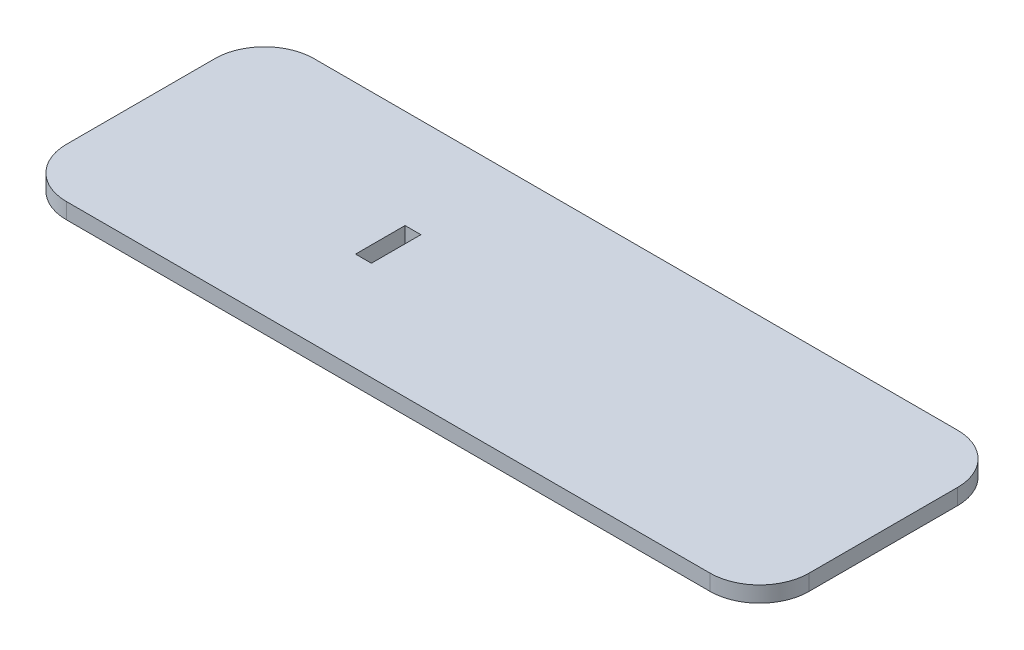
ISO-10303-21;
HEADER;
FILE_DESCRIPTION(('STEP AP214'),'2;1');
FILE_NAME('part.step','',(''),(''),'','','');
FILE_SCHEMA(('AUTOMOTIVE_DESIGN { 1 0 10303 214 1 1 1 1 }'));
ENDSEC;
DATA;
#1=APPLICATION_CONTEXT('core data for automotive mechanical design processes');
#2=APPLICATION_PROTOCOL_DEFINITION('international standard','automotive_design',2000,#1);
#3=PRODUCT_CONTEXT('',#1,'mechanical');
#4=PRODUCT('Part','Part','',(#3));
#5=PRODUCT_RELATED_PRODUCT_CATEGORY('part','',(#4));
#6=PRODUCT_DEFINITION_FORMATION('','',#4);
#7=PRODUCT_DEFINITION_CONTEXT('part definition',#1,'design');
#8=PRODUCT_DEFINITION('design','',#6,#7);
#9=PRODUCT_DEFINITION_SHAPE('','',#8);
#10=(LENGTH_UNIT() NAMED_UNIT(*) SI_UNIT(.MILLI.,.METRE.));
#11=(NAMED_UNIT(*) PLANE_ANGLE_UNIT() SI_UNIT($,.RADIAN.));
#12=(NAMED_UNIT(*) SI_UNIT($,.STERADIAN.) SOLID_ANGLE_UNIT());
#13=UNCERTAINTY_MEASURE_WITH_UNIT(LENGTH_MEASURE(1.E-05),#10,'distance_accuracy_value','');
#14=(GEOMETRIC_REPRESENTATION_CONTEXT(3) GLOBAL_UNCERTAINTY_ASSIGNED_CONTEXT((#13)) GLOBAL_UNIT_ASSIGNED_CONTEXT((#10,
#11,#12)) REPRESENTATION_CONTEXT('',''));
#15=CARTESIAN_POINT('',(0.,0.,0.));
#16=DIRECTION('',(0.,0.,1.));
#17=DIRECTION('',(1.,0.,0.));
#18=AXIS2_PLACEMENT_3D('',#15,#16,#17);
#19=CARTESIAN_POINT('',(0.,3.2,0.));
#20=DIRECTION('',(0.,1.,0.));
#21=DIRECTION('',(0.,0.,1.));
#22=AXIS2_PLACEMENT_3D('',#19,#20,#21);
#23=PLANE('',#22);
#24=DIRECTION('',(-1.,0.,0.));
#25=VECTOR('',#24,1.);
#26=CARTESIAN_POINT('',(-75.,3.2,-25.));
#27=LINE('',#26,#25);
#28=CARTESIAN_POINT('',(65.,3.2,-25.));
#29=VERTEX_POINT('',#28);
#30=CARTESIAN_POINT('',(-65.,3.2,-25.));
#31=VERTEX_POINT('',#30);
#32=EDGE_CURVE('E179',#29,#31,#27,.T.);
#33=ORIENTED_EDGE('',*,*,#32,.T.);
#34=CARTESIAN_POINT('',(-65.,3.2,-15.));
#35=DIRECTION('',(0.,1.,0.));
#36=DIRECTION('',(0.,0.,1.));
#37=AXIS2_PLACEMENT_3D('',#34,#35,#36);
#38=CIRCLE('',#37,10.);
#39=CARTESIAN_POINT('',(-75.,3.2,-15.));
#40=VERTEX_POINT('',#39);
#41=EDGE_CURVE('E198',#31,#40,#38,.T.);
#42=ORIENTED_EDGE('',*,*,#41,.T.);
#43=DIRECTION('',(0.,0.,1.));
#44=VECTOR('',#43,1.);
#45=CARTESIAN_POINT('',(-75.,3.2,-25.));
#46=LINE('',#45,#44);
#47=CARTESIAN_POINT('',(-75.,3.2,15.));
#48=VERTEX_POINT('',#47);
#49=EDGE_CURVE('E204',#40,#48,#46,.T.);
#50=ORIENTED_EDGE('',*,*,#49,.T.);
#51=CARTESIAN_POINT('',(-65.,3.2,15.));
#52=DIRECTION('',(0.,1.,0.));
#53=DIRECTION('',(0.,0.,1.));
#54=AXIS2_PLACEMENT_3D('',#51,#52,#53);
#55=CIRCLE('',#54,10.);
#56=CARTESIAN_POINT('',(-65.,3.2,25.));
#57=VERTEX_POINT('',#56);
#58=EDGE_CURVE('E57',#48,#57,#55,.T.);
#59=ORIENTED_EDGE('',*,*,#58,.T.);
#60=DIRECTION('',(1.,0.,0.));
#61=VECTOR('',#60,1.);
#62=CARTESIAN_POINT('',(-75.,3.2,25.));
#63=LINE('',#62,#61);
#64=CARTESIAN_POINT('',(65.,3.2,25.));
#65=VERTEX_POINT('',#64);
#66=EDGE_CURVE('E206',#57,#65,#63,.T.);
#67=ORIENTED_EDGE('',*,*,#66,.T.);
#68=CARTESIAN_POINT('',(65.,3.2,15.));
#69=DIRECTION('',(0.,1.,0.));
#70=DIRECTION('',(0.,0.,1.));
#71=AXIS2_PLACEMENT_3D('',#68,#69,#70);
#72=CIRCLE('',#71,10.);
#73=CARTESIAN_POINT('',(75.,3.2,15.));
#74=VERTEX_POINT('',#73);
#75=EDGE_CURVE('E188',#65,#74,#72,.T.);
#76=ORIENTED_EDGE('',*,*,#75,.T.);
#77=DIRECTION('',(0.,0.,-1.));
#78=VECTOR('',#77,1.);
#79=CARTESIAN_POINT('',(75.,3.2,-25.));
#80=LINE('',#79,#78);
#81=CARTESIAN_POINT('',(75.,3.2,-15.));
#82=VERTEX_POINT('',#81);
#83=EDGE_CURVE('E175',#74,#82,#80,.T.);
#84=ORIENTED_EDGE('',*,*,#83,.T.);
#85=CARTESIAN_POINT('',(65.,3.2,-15.));
#86=DIRECTION('',(0.,1.,0.));
#87=DIRECTION('',(0.,0.,1.));
#88=AXIS2_PLACEMENT_3D('',#85,#86,#87);
#89=CIRCLE('',#88,10.);
#90=EDGE_CURVE('E191',#82,#29,#89,.T.);
#91=ORIENTED_EDGE('',*,*,#90,.T.);
#92=EDGE_LOOP('',(#33,#42,#50,#59,#67,#76,#84,#91));
#93=FACE_BOUND('',#92,.T.);
#94=DIRECTION('',(-1.,0.,0.));
#95=VECTOR('',#94,1.);
#96=CARTESIAN_POINT('',(-26.6,3.2,-5.00000000000001));
#97=LINE('',#96,#95);
#98=CARTESIAN_POINT('',(-23.4,3.2,-5.00000000000001));
#99=VERTEX_POINT('',#98);
#100=CARTESIAN_POINT('',(-26.6,3.2,-5.00000000000001));
#101=VERTEX_POINT('',#100);
#102=EDGE_CURVE('E136',#99,#101,#97,.T.);
#103=ORIENTED_EDGE('',*,*,#102,.F.);
#104=DIRECTION('',(0.,0.,-1.));
#105=VECTOR('',#104,1.);
#106=CARTESIAN_POINT('',(-23.4,3.2,-5.00000000000001));
#107=LINE('',#106,#105);
#108=CARTESIAN_POINT('',(-23.4,3.2,4.99999999999999));
#109=VERTEX_POINT('',#108);
#110=EDGE_CURVE('E126',#109,#99,#107,.T.);
#111=ORIENTED_EDGE('',*,*,#110,.F.);
#112=DIRECTION('',(1.,0.,0.));
#113=VECTOR('',#112,1.);
#114=CARTESIAN_POINT('',(-26.6,3.2,4.99999999999999));
#115=LINE('',#114,#113);
#116=CARTESIAN_POINT('',(-26.6,3.2,4.99999999999999));
#117=VERTEX_POINT('',#116);
#118=EDGE_CURVE('E151',#117,#109,#115,.T.);
#119=ORIENTED_EDGE('',*,*,#118,.F.);
#120=DIRECTION('',(0.,0.,1.));
#121=VECTOR('',#120,1.);
#122=CARTESIAN_POINT('',(-26.6,3.2,-5.00000000000001));
#123=LINE('',#122,#121);
#124=EDGE_CURVE('E149',#101,#117,#123,.T.);
#125=ORIENTED_EDGE('',*,*,#124,.F.);
#126=EDGE_LOOP('',(#103,#111,#119,#125));
#127=FACE_BOUND('',#126,.T.);
#128=ADVANCED_FACE('F35',(#93,#127),#23,.T.);
#129=CARTESIAN_POINT('',(0.,0.,0.));
#130=DIRECTION('',(0.,1.,0.));
#131=DIRECTION('',(0.,0.,1.));
#132=AXIS2_PLACEMENT_3D('',#129,#130,#131);
#133=PLANE('',#132);
#134=DIRECTION('',(0.,0.,1.));
#135=VECTOR('',#134,1.);
#136=CARTESIAN_POINT('',(-75.,0.,-25.));
#137=LINE('',#136,#135);
#138=CARTESIAN_POINT('',(-75.,0.,-15.));
#139=VERTEX_POINT('',#138);
#140=CARTESIAN_POINT('',(-75.,0.,15.));
#141=VERTEX_POINT('',#140);
#142=EDGE_CURVE('E215',#139,#141,#137,.T.);
#143=ORIENTED_EDGE('',*,*,#142,.F.);
#144=CARTESIAN_POINT('',(-65.,0.,-15.));
#145=DIRECTION('',(0.,1.,0.));
#146=DIRECTION('',(0.,0.,1.));
#147=AXIS2_PLACEMENT_3D('',#144,#145,#146);
#148=CIRCLE('',#147,10.);
#149=CARTESIAN_POINT('',(-65.,0.,-25.));
#150=VERTEX_POINT('',#149);
#151=EDGE_CURVE('E229',#139,#150,#148,.F.);
#152=ORIENTED_EDGE('',*,*,#151,.T.);
#153=DIRECTION('',(-1.,0.,0.));
#154=VECTOR('',#153,1.);
#155=CARTESIAN_POINT('',(-75.,0.,-25.));
#156=LINE('',#155,#154);
#157=CARTESIAN_POINT('',(65.,0.,-25.));
#158=VERTEX_POINT('',#157);
#159=EDGE_CURVE('E212',#158,#150,#156,.T.);
#160=ORIENTED_EDGE('',*,*,#159,.F.);
#161=CARTESIAN_POINT('',(65.,0.,-15.));
#162=DIRECTION('',(0.,1.,0.));
#163=DIRECTION('',(0.,0.,1.));
#164=AXIS2_PLACEMENT_3D('',#161,#162,#163);
#165=CIRCLE('',#164,10.);
#166=CARTESIAN_POINT('',(75.,0.,-15.));
#167=VERTEX_POINT('',#166);
#168=EDGE_CURVE('E225',#158,#167,#165,.F.);
#169=ORIENTED_EDGE('',*,*,#168,.T.);
#170=DIRECTION('',(0.,0.,-1.));
#171=VECTOR('',#170,1.);
#172=CARTESIAN_POINT('',(75.,0.,-25.));
#173=LINE('',#172,#171);
#174=CARTESIAN_POINT('',(75.,0.,15.));
#175=VERTEX_POINT('',#174);
#176=EDGE_CURVE('E144',#175,#167,#173,.T.);
#177=ORIENTED_EDGE('',*,*,#176,.F.);
#178=CARTESIAN_POINT('',(65.,0.,15.));
#179=DIRECTION('',(0.,1.,0.));
#180=DIRECTION('',(0.,0.,1.));
#181=AXIS2_PLACEMENT_3D('',#178,#179,#180);
#182=CIRCLE('',#181,10.);
#183=CARTESIAN_POINT('',(65.,0.,25.));
#184=VERTEX_POINT('',#183);
#185=EDGE_CURVE('E223',#175,#184,#182,.F.);
#186=ORIENTED_EDGE('',*,*,#185,.T.);
#187=DIRECTION('',(1.,0.,0.));
#188=VECTOR('',#187,1.);
#189=CARTESIAN_POINT('',(-75.,0.,25.));
#190=LINE('',#189,#188);
#191=CARTESIAN_POINT('',(-65.,0.,25.));
#192=VERTEX_POINT('',#191);
#193=EDGE_CURVE('E180',#192,#184,#190,.T.);
#194=ORIENTED_EDGE('',*,*,#193,.F.);
#195=CARTESIAN_POINT('',(-65.,0.,15.));
#196=DIRECTION('',(0.,1.,0.));
#197=DIRECTION('',(0.,0.,1.));
#198=AXIS2_PLACEMENT_3D('',#195,#196,#197);
#199=CIRCLE('',#198,10.);
#200=EDGE_CURVE('E227',#192,#141,#199,.F.);
#201=ORIENTED_EDGE('',*,*,#200,.T.);
#202=EDGE_LOOP('',(#143,#152,#160,#169,#177,#186,#194,#201));
#203=FACE_BOUND('',#202,.T.);
#204=DIRECTION('',(0.,0.,-1.));
#205=VECTOR('',#204,1.);
#206=CARTESIAN_POINT('',(-23.4,0.,-5.00000000000001));
#207=LINE('',#206,#205);
#208=CARTESIAN_POINT('',(-23.4,0.,4.99999999999999));
#209=VERTEX_POINT('',#208);
#210=CARTESIAN_POINT('',(-23.4,0.,-5.00000000000001));
#211=VERTEX_POINT('',#210);
#212=EDGE_CURVE('E163',#209,#211,#207,.T.);
#213=ORIENTED_EDGE('',*,*,#212,.T.);
#214=DIRECTION('',(-1.,0.,0.));
#215=VECTOR('',#214,1.);
#216=CARTESIAN_POINT('',(-26.6,0.,-5.00000000000001));
#217=LINE('',#216,#215);
#218=CARTESIAN_POINT('',(-26.6,0.,-5.00000000000001));
#219=VERTEX_POINT('',#218);
#220=EDGE_CURVE('E143',#211,#219,#217,.T.);
#221=ORIENTED_EDGE('',*,*,#220,.T.);
#222=DIRECTION('',(0.,0.,1.));
#223=VECTOR('',#222,1.);
#224=CARTESIAN_POINT('',(-26.6,0.,-5.00000000000001));
#225=LINE('',#224,#223);
#226=CARTESIAN_POINT('',(-26.6,0.,4.99999999999999));
#227=VERTEX_POINT('',#226);
#228=EDGE_CURVE('E166',#219,#227,#225,.T.);
#229=ORIENTED_EDGE('',*,*,#228,.T.);
#230=DIRECTION('',(1.,0.,0.));
#231=VECTOR('',#230,1.);
#232=CARTESIAN_POINT('',(-26.6,0.,4.99999999999999));
#233=LINE('',#232,#231);
#234=EDGE_CURVE('E137',#227,#209,#233,.T.);
#235=ORIENTED_EDGE('',*,*,#234,.T.);
#236=EDGE_LOOP('',(#213,#221,#229,#235));
#237=FACE_BOUND('',#236,.T.);
#238=ADVANCED_FACE('F259',(#203,#237),#133,.F.);
#239=CARTESIAN_POINT('',(75.,3.2,-25.));
#240=DIRECTION('',(-1.,0.,0.));
#241=DIRECTION('',(0.,0.,1.));
#242=AXIS2_PLACEMENT_3D('',#239,#240,#241);
#243=PLANE('',#242);
#244=ORIENTED_EDGE('',*,*,#176,.T.);
#245=DIRECTION('',(0.,-1.,0.));
#246=VECTOR('',#245,1.);
#247=CARTESIAN_POINT('',(75.,3.2,-15.));
#248=LINE('',#247,#246);
#249=EDGE_CURVE('E12',#167,#82,#248,.F.);
#250=ORIENTED_EDGE('',*,*,#249,.T.);
#251=ORIENTED_EDGE('',*,*,#83,.F.);
#252=DIRECTION('',(0.,-1.,0.));
#253=VECTOR('',#252,1.);
#254=CARTESIAN_POINT('',(75.,3.2,15.));
#255=LINE('',#254,#253);
#256=EDGE_CURVE('E43',#74,#175,#255,.T.);
#257=ORIENTED_EDGE('',*,*,#256,.T.);
#258=EDGE_LOOP('',(#244,#250,#251,#257));
#259=FACE_BOUND('',#258,.T.);
#260=ADVANCED_FACE('F253',(#259),#243,.F.);
#261=CARTESIAN_POINT('',(-75.,3.2,-25.));
#262=DIRECTION('',(0.,0.,1.));
#263=DIRECTION('',(1.,0.,0.));
#264=AXIS2_PLACEMENT_3D('',#261,#262,#263);
#265=PLANE('',#264);
#266=ORIENTED_EDGE('',*,*,#159,.T.);
#267=DIRECTION('',(0.,-1.,0.));
#268=VECTOR('',#267,1.);
#269=CARTESIAN_POINT('',(-65.,3.2,-25.));
#270=LINE('',#269,#268);
#271=EDGE_CURVE('E192',#150,#31,#270,.F.);
#272=ORIENTED_EDGE('',*,*,#271,.T.);
#273=ORIENTED_EDGE('',*,*,#32,.F.);
#274=DIRECTION('',(0.,-1.,0.));
#275=VECTOR('',#274,1.);
#276=CARTESIAN_POINT('',(65.,3.2,-25.));
#277=LINE('',#276,#275);
#278=EDGE_CURVE('E230',#29,#158,#277,.T.);
#279=ORIENTED_EDGE('',*,*,#278,.T.);
#280=EDGE_LOOP('',(#266,#272,#273,#279));
#281=FACE_BOUND('',#280,.T.);
#282=ADVANCED_FACE('F238',(#281),#265,.F.);
#283=CARTESIAN_POINT('',(-75.,3.2,-25.));
#284=DIRECTION('',(1.,0.,0.));
#285=DIRECTION('',(0.,0.,-1.));
#286=AXIS2_PLACEMENT_3D('',#283,#284,#285);
#287=PLANE('',#286);
#288=ORIENTED_EDGE('',*,*,#49,.F.);
#289=DIRECTION('',(0.,-1.,0.));
#290=VECTOR('',#289,1.);
#291=CARTESIAN_POINT('',(-75.,3.2,-15.));
#292=LINE('',#291,#290);
#293=EDGE_CURVE('E220',#40,#139,#292,.T.);
#294=ORIENTED_EDGE('',*,*,#293,.T.);
#295=ORIENTED_EDGE('',*,*,#142,.T.);
#296=DIRECTION('',(0.,-1.,0.));
#297=VECTOR('',#296,1.);
#298=CARTESIAN_POINT('',(-75.,3.2,15.));
#299=LINE('',#298,#297);
#300=EDGE_CURVE('E209',#141,#48,#299,.F.);
#301=ORIENTED_EDGE('',*,*,#300,.T.);
#302=EDGE_LOOP('',(#288,#294,#295,#301));
#303=FACE_BOUND('',#302,.T.);
#304=ADVANCED_FACE('F281',(#303),#287,.F.);
#305=CARTESIAN_POINT('',(-75.,3.2,25.));
#306=DIRECTION('',(0.,0.,-1.));
#307=DIRECTION('',(-1.,0.,0.));
#308=AXIS2_PLACEMENT_3D('',#305,#306,#307);
#309=PLANE('',#308);
#310=ORIENTED_EDGE('',*,*,#66,.F.);
#311=DIRECTION('',(0.,-1.,0.));
#312=VECTOR('',#311,1.);
#313=CARTESIAN_POINT('',(-65.,3.2,25.));
#314=LINE('',#313,#312);
#315=EDGE_CURVE('E245',#57,#192,#314,.T.);
#316=ORIENTED_EDGE('',*,*,#315,.T.);
#317=ORIENTED_EDGE('',*,*,#193,.T.);
#318=DIRECTION('',(0.,-1.,0.));
#319=VECTOR('',#318,1.);
#320=CARTESIAN_POINT('',(65.,3.2,25.));
#321=LINE('',#320,#319);
#322=EDGE_CURVE('E50',#184,#65,#321,.F.);
#323=ORIENTED_EDGE('',*,*,#322,.T.);
#324=EDGE_LOOP('',(#310,#316,#317,#323));
#325=FACE_BOUND('',#324,.T.);
#326=ADVANCED_FACE('F278',(#325),#309,.F.);
#327=CARTESIAN_POINT('',(-23.4,3.2,-5.00000000000001));
#328=DIRECTION('',(-1.,0.,0.));
#329=DIRECTION('',(0.,0.,1.));
#330=AXIS2_PLACEMENT_3D('',#327,#328,#329);
#331=PLANE('',#330);
#332=ORIENTED_EDGE('',*,*,#212,.F.);
#333=DIRECTION('',(0.,-1.,0.));
#334=VECTOR('',#333,1.);
#335=CARTESIAN_POINT('',(-23.4,3.2,4.99999999999999));
#336=LINE('',#335,#334);
#337=EDGE_CURVE('E132',#109,#209,#336,.T.);
#338=ORIENTED_EDGE('',*,*,#337,.F.);
#339=ORIENTED_EDGE('',*,*,#110,.T.);
#340=DIRECTION('',(0.,-1.,0.));
#341=VECTOR('',#340,1.);
#342=CARTESIAN_POINT('',(-23.4,3.2,-5.00000000000001));
#343=LINE('',#342,#341);
#344=EDGE_CURVE('E129',#99,#211,#343,.T.);
#345=ORIENTED_EDGE('',*,*,#344,.T.);
#346=EDGE_LOOP('',(#332,#338,#339,#345));
#347=FACE_BOUND('',#346,.T.);
#348=ADVANCED_FACE('F128',(#347),#331,.T.);
#349=CARTESIAN_POINT('',(-26.6,3.2,-5.00000000000001));
#350=DIRECTION('',(0.,0.,1.));
#351=DIRECTION('',(1.,0.,0.));
#352=AXIS2_PLACEMENT_3D('',#349,#350,#351);
#353=PLANE('',#352);
#354=ORIENTED_EDGE('',*,*,#220,.F.);
#355=ORIENTED_EDGE('',*,*,#344,.F.);
#356=ORIENTED_EDGE('',*,*,#102,.T.);
#357=DIRECTION('',(0.,-1.,0.));
#358=VECTOR('',#357,1.);
#359=CARTESIAN_POINT('',(-26.6,3.2,-5.00000000000001));
#360=LINE('',#359,#358);
#361=EDGE_CURVE('E145',#101,#219,#360,.T.);
#362=ORIENTED_EDGE('',*,*,#361,.T.);
#363=EDGE_LOOP('',(#354,#355,#356,#362));
#364=FACE_BOUND('',#363,.T.);
#365=ADVANCED_FACE('F140',(#364),#353,.T.);
#366=CARTESIAN_POINT('',(-26.6,3.2,-5.00000000000001));
#367=DIRECTION('',(1.,0.,0.));
#368=DIRECTION('',(0.,0.,-1.));
#369=AXIS2_PLACEMENT_3D('',#366,#367,#368);
#370=PLANE('',#369);
#371=ORIENTED_EDGE('',*,*,#228,.F.);
#372=ORIENTED_EDGE('',*,*,#361,.F.);
#373=ORIENTED_EDGE('',*,*,#124,.T.);
#374=DIRECTION('',(0.,-1.,0.));
#375=VECTOR('',#374,1.);
#376=CARTESIAN_POINT('',(-26.6,3.2,4.99999999999999));
#377=LINE('',#376,#375);
#378=EDGE_CURVE('E172',#117,#227,#377,.T.);
#379=ORIENTED_EDGE('',*,*,#378,.T.);
#380=EDGE_LOOP('',(#371,#372,#373,#379));
#381=FACE_BOUND('',#380,.T.);
#382=ADVANCED_FACE('F325',(#381),#370,.T.);
#383=CARTESIAN_POINT('',(-26.6,3.2,4.99999999999999));
#384=DIRECTION('',(0.,0.,-1.));
#385=DIRECTION('',(-1.,0.,0.));
#386=AXIS2_PLACEMENT_3D('',#383,#384,#385);
#387=PLANE('',#386);
#388=ORIENTED_EDGE('',*,*,#234,.F.);
#389=ORIENTED_EDGE('',*,*,#378,.F.);
#390=ORIENTED_EDGE('',*,*,#118,.T.);
#391=ORIENTED_EDGE('',*,*,#337,.T.);
#392=EDGE_LOOP('',(#388,#389,#390,#391));
#393=FACE_BOUND('',#392,.T.);
#394=ADVANCED_FACE('F291',(#393),#387,.T.);
#395=CARTESIAN_POINT('',(-65.,3.2,-15.));
#396=DIRECTION('',(0.,-1.,0.));
#397=DIRECTION('',(0.,0.,-1.));
#398=AXIS2_PLACEMENT_3D('',#395,#396,#397);
#399=CYLINDRICAL_SURFACE('',#398,10.);
#400=ORIENTED_EDGE('',*,*,#41,.F.);
#401=ORIENTED_EDGE('',*,*,#271,.F.);
#402=ORIENTED_EDGE('',*,*,#151,.F.);
#403=ORIENTED_EDGE('',*,*,#293,.F.);
#404=EDGE_LOOP('',(#400,#401,#402,#403));
#405=FACE_BOUND('',#404,.T.);
#406=ADVANCED_FACE('F244',(#405),#399,.T.);
#407=CARTESIAN_POINT('',(-65.,3.2,15.));
#408=DIRECTION('',(0.,-1.,0.));
#409=DIRECTION('',(0.,0.,-1.));
#410=AXIS2_PLACEMENT_3D('',#407,#408,#409);
#411=CYLINDRICAL_SURFACE('',#410,10.);
#412=ORIENTED_EDGE('',*,*,#58,.F.);
#413=ORIENTED_EDGE('',*,*,#300,.F.);
#414=ORIENTED_EDGE('',*,*,#200,.F.);
#415=ORIENTED_EDGE('',*,*,#315,.F.);
#416=EDGE_LOOP('',(#412,#413,#414,#415));
#417=FACE_BOUND('',#416,.T.);
#418=ADVANCED_FACE('F268',(#417),#411,.T.);
#419=CARTESIAN_POINT('',(65.,3.2,-15.));
#420=DIRECTION('',(0.,-1.,0.));
#421=DIRECTION('',(0.,0.,-1.));
#422=AXIS2_PLACEMENT_3D('',#419,#420,#421);
#423=CYLINDRICAL_SURFACE('',#422,10.);
#424=ORIENTED_EDGE('',*,*,#90,.F.);
#425=ORIENTED_EDGE('',*,*,#249,.F.);
#426=ORIENTED_EDGE('',*,*,#168,.F.);
#427=ORIENTED_EDGE('',*,*,#278,.F.);
#428=EDGE_LOOP('',(#424,#425,#426,#427));
#429=FACE_BOUND('',#428,.T.);
#430=ADVANCED_FACE('F263',(#429),#423,.T.);
#431=CARTESIAN_POINT('',(65.,3.2,15.));
#432=DIRECTION('',(0.,-1.,0.));
#433=DIRECTION('',(0.,0.,-1.));
#434=AXIS2_PLACEMENT_3D('',#431,#432,#433);
#435=CYLINDRICAL_SURFACE('',#434,10.);
#436=ORIENTED_EDGE('',*,*,#75,.F.);
#437=ORIENTED_EDGE('',*,*,#322,.F.);
#438=ORIENTED_EDGE('',*,*,#185,.F.);
#439=ORIENTED_EDGE('',*,*,#256,.F.);
#440=EDGE_LOOP('',(#436,#437,#438,#439));
#441=FACE_BOUND('',#440,.T.);
#442=ADVANCED_FACE('F37',(#441),#435,.T.);
#443=CLOSED_SHELL('',(#128,#238,#260,#282,#304,#326,#348,#365,#382,#394,#406,#418,#430,#442));
#444=MANIFOLD_SOLID_BREP('B2',#443);
#445=ADVANCED_BREP_SHAPE_REPRESENTATION('',(#18,#444),#14);
#446=SHAPE_DEFINITION_REPRESENTATION(#9,#445);
ENDSEC;
END-ISO-10303-21;
